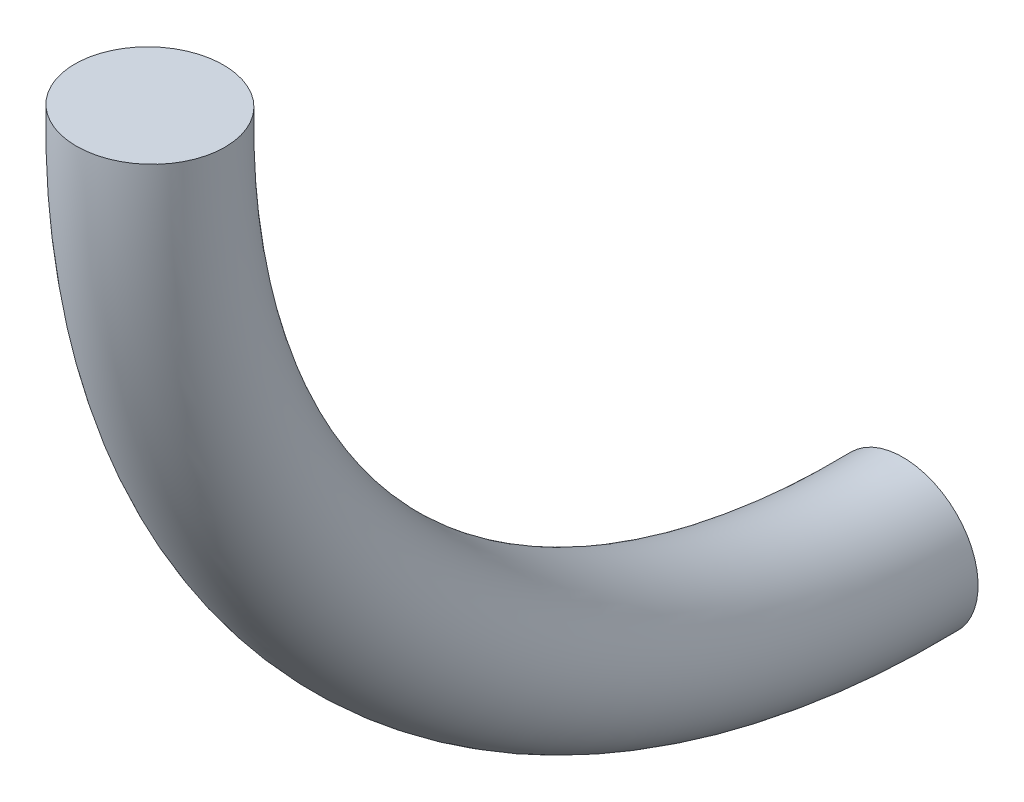
ISO-10303-21;
HEADER;
FILE_DESCRIPTION(('STEP AP214'),'2;1');
FILE_NAME('part.step','',(''),(''),'','','');
FILE_SCHEMA(('AUTOMOTIVE_DESIGN { 1 0 10303 214 1 1 1 1 }'));
ENDSEC;
DATA;
#1=APPLICATION_CONTEXT('core data for automotive mechanical design processes');
#2=APPLICATION_PROTOCOL_DEFINITION('international standard','automotive_design',2000,#1);
#3=PRODUCT_CONTEXT('',#1,'mechanical');
#4=PRODUCT('Part','Part','',(#3));
#5=PRODUCT_RELATED_PRODUCT_CATEGORY('part','',(#4));
#6=PRODUCT_DEFINITION_FORMATION('','',#4);
#7=PRODUCT_DEFINITION_CONTEXT('part definition',#1,'design');
#8=PRODUCT_DEFINITION('design','',#6,#7);
#9=PRODUCT_DEFINITION_SHAPE('','',#8);
#10=(LENGTH_UNIT() NAMED_UNIT(*) SI_UNIT(.MILLI.,.METRE.));
#11=(NAMED_UNIT(*) PLANE_ANGLE_UNIT() SI_UNIT($,.RADIAN.));
#12=(NAMED_UNIT(*) SI_UNIT($,.STERADIAN.) SOLID_ANGLE_UNIT());
#13=UNCERTAINTY_MEASURE_WITH_UNIT(LENGTH_MEASURE(1.E-05),#10,'distance_accuracy_value','');
#14=(GEOMETRIC_REPRESENTATION_CONTEXT(3) GLOBAL_UNCERTAINTY_ASSIGNED_CONTEXT((#13)) GLOBAL_UNIT_ASSIGNED_CONTEXT((#10,
#11,#12)) REPRESENTATION_CONTEXT('',''));
#15=CARTESIAN_POINT('',(0.,0.,0.));
#16=DIRECTION('',(0.,0.,1.));
#17=DIRECTION('',(1.,0.,0.));
#18=AXIS2_PLACEMENT_3D('',#15,#16,#17);
#19=CARTESIAN_POINT('',(0.,0.,0.));
#20=DIRECTION('',(0.,-0.999767214935237,0.0215758184233974));
#21=DIRECTION('',(0.,-0.0215758184233974,-0.999767214935237));
#22=AXIS2_PLACEMENT_3D('',#19,#20,#21);
#23=PLANE('',#22);
#24=CARTESIAN_POINT('',(0.,0.,0.));
#25=DIRECTION('',(0.,-0.999767214935237,0.0215758184233974));
#26=DIRECTION('',(0.,-0.0215758184233974,-0.999767214935237));
#27=AXIS2_PLACEMENT_3D('',#24,#25,#26);
#28=CIRCLE('',#27,39.);
#29=CARTESIAN_POINT('',(0.,0.8414569185125,38.9909213824742));
#30=VERTEX_POINT('',#29);
#31=EDGE_CURVE('E50',#30,#30,#28,.T.);
#32=ORIENTED_EDGE('',*,*,#31,.F.);
#33=EDGE_LOOP('',(#32));
#34=FACE_BOUND('',#33,.T.);
#35=ADVANCED_FACE('F43',(#34),#23,.F.);
#36=CARTESIAN_POINT('',(0.,-400.,-400.));
#37=DIRECTION('',(0.,0.0215758184233976,-0.999767214935237));
#38=DIRECTION('',(0.,0.999767214935237,0.0215758184233976));
#39=AXIS2_PLACEMENT_3D('',#36,#37,#38);
#40=PLANE('',#39);
#41=CARTESIAN_POINT('',(0.,-400.,-400.));
#42=DIRECTION('',(0.,0.0215758184233976,-0.999767214935237));
#43=DIRECTION('',(0.,0.999767214935237,0.0215758184233976));
#44=AXIS2_PLACEMENT_3D('',#41,#42,#43);
#45=CIRCLE('',#44,39.);
#46=CARTESIAN_POINT('',(0.,-438.990921382474,-400.841456918513));
#47=VERTEX_POINT('',#46);
#48=EDGE_CURVE('E11',#47,#47,#45,.T.);
#49=ORIENTED_EDGE('',*,*,#48,.T.);
#50=EDGE_LOOP('',(#49));
#51=FACE_BOUND('',#50,.T.);
#52=ADVANCED_FACE('F60',(#51),#40,.T.);
#53=CARTESIAN_POINT('',(0.,-8.44997918180201,-391.550020818198));
#54=DIRECTION('',(1.,0.,0.));
#55=DIRECTION('',(0.,0.,-1.));
#56=AXIS2_PLACEMENT_3D('',#53,#54,#55);
#57=TOROIDAL_SURFACE('',#56,391.641189037752,39.);
#58=CARTESIAN_POINT('',(0.,-8.44997918180201,-391.550020818198));
#59=DIRECTION('',(1.,0.,0.));
#60=DIRECTION('',(0.,0.,-1.));
#61=AXIS2_PLACEMENT_3D('',#58,#59,#60);
#62=CIRCLE('',#61,430.641189037752);
#63=EDGE_CURVE('',#30,#47,#62,.T.);
#64=ORIENTED_EDGE('',*,*,#31,.T.);
#65=ORIENTED_EDGE('',*,*,#48,.F.);
#66=ORIENTED_EDGE('',*,*,#63,.T.);
#67=ORIENTED_EDGE('',*,*,#63,.F.);
#68=EDGE_LOOP('',(#64,#66,#65,#67));
#69=FACE_BOUND('',#68,.T.);
#70=ADVANCED_FACE('F57',(#69),#57,.T.);
#71=CLOSED_SHELL('',(#35,#52,#70));
#72=MANIFOLD_SOLID_BREP('B2',#71);
#73=ADVANCED_BREP_SHAPE_REPRESENTATION('',(#18,#72),#14);
#74=SHAPE_DEFINITION_REPRESENTATION(#9,#73);
ENDSEC;
END-ISO-10303-21;
